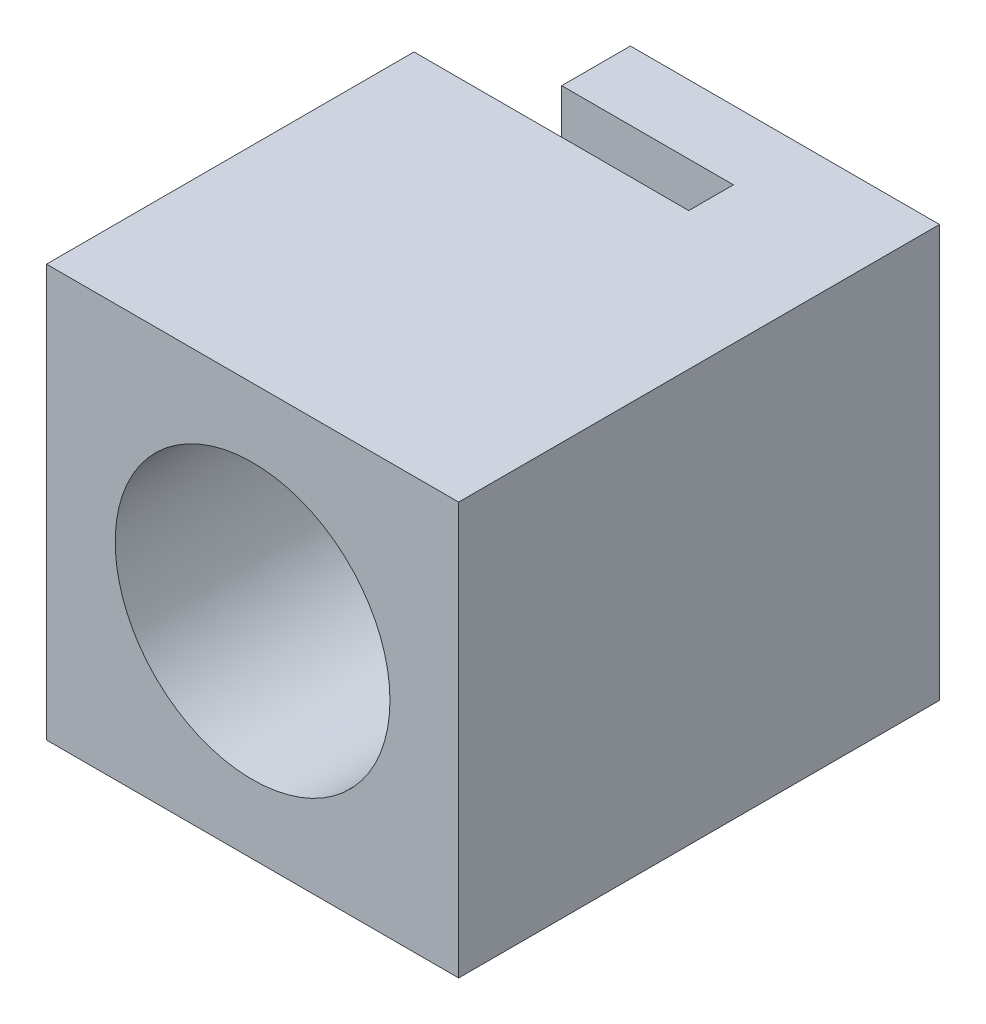
ISO-10303-21;
HEADER;
FILE_DESCRIPTION(('STEP AP214'),'2;1');
FILE_NAME('part.step','',(''),(''),'','','');
FILE_SCHEMA(('AUTOMOTIVE_DESIGN { 1 0 10303 214 1 1 1 1 }'));
ENDSEC;
DATA;
#1=APPLICATION_CONTEXT('core data for automotive mechanical design processes');
#2=APPLICATION_PROTOCOL_DEFINITION('international standard','automotive_design',2000,#1);
#3=PRODUCT_CONTEXT('',#1,'mechanical');
#4=PRODUCT('Part','Part','',(#3));
#5=PRODUCT_RELATED_PRODUCT_CATEGORY('part','',(#4));
#6=PRODUCT_DEFINITION_FORMATION('','',#4);
#7=PRODUCT_DEFINITION_CONTEXT('part definition',#1,'design');
#8=PRODUCT_DEFINITION('design','',#6,#7);
#9=PRODUCT_DEFINITION_SHAPE('','',#8);
#10=(LENGTH_UNIT() NAMED_UNIT(*) SI_UNIT(.MILLI.,.METRE.));
#11=(NAMED_UNIT(*) PLANE_ANGLE_UNIT() SI_UNIT($,.RADIAN.));
#12=(NAMED_UNIT(*) SI_UNIT($,.STERADIAN.) SOLID_ANGLE_UNIT());
#13=UNCERTAINTY_MEASURE_WITH_UNIT(LENGTH_MEASURE(1.E-05),#10,'distance_accuracy_value','');
#14=(GEOMETRIC_REPRESENTATION_CONTEXT(3) GLOBAL_UNCERTAINTY_ASSIGNED_CONTEXT((#13)) GLOBAL_UNIT_ASSIGNED_CONTEXT((#10,
#11,#12)) REPRESENTATION_CONTEXT('',''));
#15=CARTESIAN_POINT('',(0.,0.,0.));
#16=DIRECTION('',(0.,0.,1.));
#17=DIRECTION('',(1.,0.,0.));
#18=AXIS2_PLACEMENT_3D('',#15,#16,#17);
#19=CARTESIAN_POINT('',(-6.,6.,14.));
#20=DIRECTION('',(0.,-1.,0.));
#21=DIRECTION('',(0.,0.,-1.));
#22=AXIS2_PLACEMENT_3D('',#19,#20,#21);
#23=PLANE('',#22);
#24=DIRECTION('',(0.,0.,-1.));
#25=VECTOR('',#24,1.);
#26=CARTESIAN_POINT('',(-3.,6.,14.));
#27=LINE('',#26,#25);
#28=CARTESIAN_POINT('',(-3.,6.,2.));
#29=VERTEX_POINT('',#28);
#30=CARTESIAN_POINT('',(-3.,6.,0.));
#31=VERTEX_POINT('',#30);
#32=EDGE_CURVE('E97',#29,#31,#27,.T.);
#33=ORIENTED_EDGE('',*,*,#32,.F.);
#34=DIRECTION('',(1.,0.,0.));
#35=VECTOR('',#34,1.);
#36=CARTESIAN_POINT('',(-6.,6.,2.));
#37=LINE('',#36,#35);
#38=CARTESIAN_POINT('',(2.,6.,2.));
#39=VERTEX_POINT('',#38);
#40=EDGE_CURVE('E105',#29,#39,#37,.T.);
#41=ORIENTED_EDGE('',*,*,#40,.T.);
#42=DIRECTION('',(0.,0.,1.));
#43=VECTOR('',#42,1.);
#44=CARTESIAN_POINT('',(2.,6.,14.));
#45=LINE('',#44,#43);
#46=CARTESIAN_POINT('',(2.,6.,3.3));
#47=VERTEX_POINT('',#46);
#48=EDGE_CURVE('E112',#39,#47,#45,.T.);
#49=ORIENTED_EDGE('',*,*,#48,.T.);
#50=DIRECTION('',(-1.,0.,0.));
#51=VECTOR('',#50,1.);
#52=CARTESIAN_POINT('',(-6.,6.,3.3));
#53=LINE('',#52,#51);
#54=CARTESIAN_POINT('',(-6.,6.,3.3));
#55=VERTEX_POINT('',#54);
#56=EDGE_CURVE('E115',#47,#55,#53,.T.);
#57=ORIENTED_EDGE('',*,*,#56,.T.);
#58=DIRECTION('',(0.,0.,-1.));
#59=VECTOR('',#58,1.);
#60=CARTESIAN_POINT('',(-6.,6.,14.));
#61=LINE('',#60,#59);
#62=CARTESIAN_POINT('',(-6.,6.,14.));
#63=VERTEX_POINT('',#62);
#64=EDGE_CURVE('E149',#63,#55,#61,.T.);
#65=ORIENTED_EDGE('',*,*,#64,.F.);
#66=DIRECTION('',(-1.,0.,0.));
#67=VECTOR('',#66,1.);
#68=CARTESIAN_POINT('',(-6.,6.,14.));
#69=LINE('',#68,#67);
#70=CARTESIAN_POINT('',(6.,6.,14.));
#71=VERTEX_POINT('',#70);
#72=EDGE_CURVE('E132',#71,#63,#69,.T.);
#73=ORIENTED_EDGE('',*,*,#72,.F.);
#74=DIRECTION('',(0.,0.,-1.));
#75=VECTOR('',#74,1.);
#76=CARTESIAN_POINT('',(6.,6.,14.));
#77=LINE('',#76,#75);
#78=CARTESIAN_POINT('',(6.,6.,0.));
#79=VERTEX_POINT('',#78);
#80=EDGE_CURVE('E152',#71,#79,#77,.T.);
#81=ORIENTED_EDGE('',*,*,#80,.T.);
#82=DIRECTION('',(-1.,0.,0.));
#83=VECTOR('',#82,1.);
#84=CARTESIAN_POINT('',(-6.,6.,0.));
#85=LINE('',#84,#83);
#86=EDGE_CURVE('E107',#79,#31,#85,.T.);
#87=ORIENTED_EDGE('',*,*,#86,.T.);
#88=EDGE_LOOP('',(#33,#41,#49,#57,#65,#73,#81,#87));
#89=FACE_BOUND('',#88,.T.);
#90=ADVANCED_FACE('F33',(#89),#23,.F.);
#91=CARTESIAN_POINT('',(-6.,-6.,14.));
#92=DIRECTION('',(0.,1.,0.));
#93=DIRECTION('',(0.,0.,1.));
#94=AXIS2_PLACEMENT_3D('',#91,#92,#93);
#95=PLANE('',#94);
#96=DIRECTION('',(0.,0.,1.));
#97=VECTOR('',#96,1.);
#98=CARTESIAN_POINT('',(-3.,-6.,14.));
#99=LINE('',#98,#97);
#100=CARTESIAN_POINT('',(-3.,-6.,0.));
#101=VERTEX_POINT('',#100);
#102=CARTESIAN_POINT('',(-3.,-6.,2.));
#103=VERTEX_POINT('',#102);
#104=EDGE_CURVE('E47',#101,#103,#99,.T.);
#105=ORIENTED_EDGE('',*,*,#104,.F.);
#106=DIRECTION('',(1.,0.,0.));
#107=VECTOR('',#106,1.);
#108=CARTESIAN_POINT('',(-6.,-6.,0.));
#109=LINE('',#108,#107);
#110=CARTESIAN_POINT('',(6.,-6.,0.));
#111=VERTEX_POINT('',#110);
#112=EDGE_CURVE('E133',#101,#111,#109,.T.);
#113=ORIENTED_EDGE('',*,*,#112,.T.);
#114=DIRECTION('',(0.,0.,-1.));
#115=VECTOR('',#114,1.);
#116=CARTESIAN_POINT('',(6.,-6.,14.));
#117=LINE('',#116,#115);
#118=CARTESIAN_POINT('',(6.,-6.,14.));
#119=VERTEX_POINT('',#118);
#120=EDGE_CURVE('E139',#119,#111,#117,.T.);
#121=ORIENTED_EDGE('',*,*,#120,.F.);
#122=DIRECTION('',(1.,0.,0.));
#123=VECTOR('',#122,1.);
#124=CARTESIAN_POINT('',(-6.,-6.,14.));
#125=LINE('',#124,#123);
#126=CARTESIAN_POINT('',(-6.,-6.,14.));
#127=VERTEX_POINT('',#126);
#128=EDGE_CURVE('E137',#127,#119,#125,.T.);
#129=ORIENTED_EDGE('',*,*,#128,.F.);
#130=DIRECTION('',(0.,0.,-1.));
#131=VECTOR('',#130,1.);
#132=CARTESIAN_POINT('',(-6.,-6.,14.));
#133=LINE('',#132,#131);
#134=CARTESIAN_POINT('',(-6.,-6.,3.3));
#135=VERTEX_POINT('',#134);
#136=EDGE_CURVE('E146',#127,#135,#133,.T.);
#137=ORIENTED_EDGE('',*,*,#136,.T.);
#138=DIRECTION('',(1.,0.,0.));
#139=VECTOR('',#138,1.);
#140=CARTESIAN_POINT('',(-6.,-6.,3.3));
#141=LINE('',#140,#139);
#142=CARTESIAN_POINT('',(2.,-6.,3.3));
#143=VERTEX_POINT('',#142);
#144=EDGE_CURVE('E41',#135,#143,#141,.T.);
#145=ORIENTED_EDGE('',*,*,#144,.T.);
#146=DIRECTION('',(0.,0.,-1.));
#147=VECTOR('',#146,1.);
#148=CARTESIAN_POINT('',(2.,-6.,14.));
#149=LINE('',#148,#147);
#150=CARTESIAN_POINT('',(2.,-6.,2.));
#151=VERTEX_POINT('',#150);
#152=EDGE_CURVE('E154',#143,#151,#149,.T.);
#153=ORIENTED_EDGE('',*,*,#152,.T.);
#154=DIRECTION('',(-1.,0.,0.));
#155=VECTOR('',#154,1.);
#156=CARTESIAN_POINT('',(-6.,-6.,2.));
#157=LINE('',#156,#155);
#158=EDGE_CURVE('E157',#151,#103,#157,.T.);
#159=ORIENTED_EDGE('',*,*,#158,.T.);
#160=EDGE_LOOP('',(#105,#113,#121,#129,#137,#145,#153,#159));
#161=FACE_BOUND('',#160,.T.);
#162=ADVANCED_FACE('F160',(#161),#95,.F.);
#163=CARTESIAN_POINT('',(0.,0.,0.));
#164=DIRECTION('',(0.,0.,1.));
#165=DIRECTION('',(1.,0.,0.));
#166=AXIS2_PLACEMENT_3D('',#163,#164,#165);
#167=PLANE('',#166);
#168=DIRECTION('',(0.,-1.,0.));
#169=VECTOR('',#168,1.);
#170=CARTESIAN_POINT('',(-3.,0.,0.));
#171=LINE('',#170,#169);
#172=EDGE_CURVE('E108',#31,#101,#171,.T.);
#173=ORIENTED_EDGE('',*,*,#172,.F.);
#174=ORIENTED_EDGE('',*,*,#86,.F.);
#175=DIRECTION('',(0.,1.,0.));
#176=VECTOR('',#175,1.);
#177=CARTESIAN_POINT('',(6.,6.,0.));
#178=LINE('',#177,#176);
#179=EDGE_CURVE('E126',#111,#79,#178,.T.);
#180=ORIENTED_EDGE('',*,*,#179,.F.);
#181=ORIENTED_EDGE('',*,*,#112,.F.);
#182=EDGE_LOOP('',(#173,#174,#180,#181));
#183=FACE_BOUND('',#182,.T.);
#184=ADVANCED_FACE('F180',(#183),#167,.F.);
#185=CARTESIAN_POINT('',(2.,-7.14827208394712,2.));
#186=DIRECTION('',(0.,0.,-1.));
#187=DIRECTION('',(-1.,0.,0.));
#188=AXIS2_PLACEMENT_3D('',#185,#186,#187);
#189=PLANE('',#188);
#190=DIRECTION('',(0.,1.,0.));
#191=VECTOR('',#190,1.);
#192=CARTESIAN_POINT('',(-3.,-7.14827208394712,2.));
#193=LINE('',#192,#191);
#194=EDGE_CURVE('E11',#103,#29,#193,.T.);
#195=ORIENTED_EDGE('',*,*,#194,.F.);
#196=ORIENTED_EDGE('',*,*,#158,.F.);
#197=DIRECTION('',(0.,-1.,0.));
#198=VECTOR('',#197,1.);
#199=CARTESIAN_POINT('',(2.,-7.14827208394712,2.));
#200=LINE('',#199,#198);
#201=EDGE_CURVE('E55',#39,#151,#200,.T.);
#202=ORIENTED_EDGE('',*,*,#201,.F.);
#203=ORIENTED_EDGE('',*,*,#40,.F.);
#204=EDGE_LOOP('',(#195,#196,#202,#203));
#205=FACE_BOUND('',#204,.T.);
#206=ADVANCED_FACE('F110',(#205),#189,.F.);
#207=CARTESIAN_POINT('',(-6.,6.,14.));
#208=DIRECTION('',(1.,0.,0.));
#209=DIRECTION('',(0.,0.,-1.));
#210=AXIS2_PLACEMENT_3D('',#207,#208,#209);
#211=PLANE('',#210);
#212=ORIENTED_EDGE('',*,*,#64,.T.);
#213=DIRECTION('',(0.,-1.,0.));
#214=VECTOR('',#213,1.);
#215=CARTESIAN_POINT('',(-6.,6.,3.3));
#216=LINE('',#215,#214);
#217=EDGE_CURVE('E111',#55,#135,#216,.T.);
#218=ORIENTED_EDGE('',*,*,#217,.T.);
#219=ORIENTED_EDGE('',*,*,#136,.F.);
#220=DIRECTION('',(0.,-1.,0.));
#221=VECTOR('',#220,1.);
#222=CARTESIAN_POINT('',(-6.,6.,14.));
#223=LINE('',#222,#221);
#224=EDGE_CURVE('E135',#63,#127,#223,.T.);
#225=ORIENTED_EDGE('',*,*,#224,.F.);
#226=EDGE_LOOP('',(#212,#218,#219,#225));
#227=FACE_BOUND('',#226,.T.);
#228=ADVANCED_FACE('F169',(#227),#211,.F.);
#229=CARTESIAN_POINT('',(6.,6.,14.));
#230=DIRECTION('',(-1.,0.,0.));
#231=DIRECTION('',(0.,-1.,0.));
#232=AXIS2_PLACEMENT_3D('',#229,#230,#231);
#233=PLANE('',#232);
#234=ORIENTED_EDGE('',*,*,#179,.T.);
#235=ORIENTED_EDGE('',*,*,#80,.F.);
#236=DIRECTION('',(0.,1.,0.));
#237=VECTOR('',#236,1.);
#238=CARTESIAN_POINT('',(6.,6.,14.));
#239=LINE('',#238,#237);
#240=EDGE_CURVE('E129',#119,#71,#239,.T.);
#241=ORIENTED_EDGE('',*,*,#240,.F.);
#242=ORIENTED_EDGE('',*,*,#120,.T.);
#243=EDGE_LOOP('',(#234,#235,#241,#242));
#244=FACE_BOUND('',#243,.T.);
#245=ADVANCED_FACE('F35',(#244),#233,.F.);
#246=CARTESIAN_POINT('',(0.,0.,14.));
#247=DIRECTION('',(0.,0.,1.));
#248=DIRECTION('',(1.,0.,0.));
#249=AXIS2_PLACEMENT_3D('',#246,#247,#248);
#250=PLANE('',#249);
#251=CARTESIAN_POINT('',(0.,0.,14.));
#252=DIRECTION('',(0.,0.,1.));
#253=DIRECTION('',(1.,0.,0.));
#254=AXIS2_PLACEMENT_3D('',#251,#252,#253);
#255=CIRCLE('',#254,4.);
#256=CARTESIAN_POINT('',(4.,0.,14.));
#257=VERTEX_POINT('',#256);
#258=EDGE_CURVE('E122',#257,#257,#255,.T.);
#259=ORIENTED_EDGE('',*,*,#258,.F.);
#260=EDGE_LOOP('',(#259));
#261=FACE_BOUND('',#260,.T.);
#262=ORIENTED_EDGE('',*,*,#240,.T.);
#263=ORIENTED_EDGE('',*,*,#72,.T.);
#264=ORIENTED_EDGE('',*,*,#224,.T.);
#265=ORIENTED_EDGE('',*,*,#128,.T.);
#266=EDGE_LOOP('',(#262,#263,#264,#265));
#267=FACE_BOUND('',#266,.T.);
#268=ADVANCED_FACE('F185',(#261,#267),#250,.T.);
#269=CARTESIAN_POINT('',(0.,0.,8.));
#270=DIRECTION('',(0.,0.,1.));
#271=DIRECTION('',(1.,0.,0.));
#272=AXIS2_PLACEMENT_3D('',#269,#270,#271);
#273=CYLINDRICAL_SURFACE('',#272,4.);
#274=CARTESIAN_POINT('',(0.,0.,8.));
#275=DIRECTION('',(0.,0.,1.));
#276=DIRECTION('',(1.,0.,0.));
#277=AXIS2_PLACEMENT_3D('',#274,#275,#276);
#278=CIRCLE('',#277,4.);
#279=CARTESIAN_POINT('',(4.,0.,8.));
#280=VERTEX_POINT('',#279);
#281=EDGE_CURVE('E123',#280,#280,#278,.T.);
#282=ORIENTED_EDGE('',*,*,#281,.F.);
#283=EDGE_LOOP('',(#282));
#284=FACE_BOUND('',#283,.T.);
#285=ORIENTED_EDGE('',*,*,#258,.T.);
#286=EDGE_LOOP('',(#285));
#287=FACE_BOUND('',#286,.T.);
#288=ADVANCED_FACE('F187',(#284,#287),#273,.F.);
#289=CARTESIAN_POINT('',(0.,0.,8.));
#290=DIRECTION('',(0.,0.,1.));
#291=DIRECTION('',(1.,0.,0.));
#292=AXIS2_PLACEMENT_3D('',#289,#290,#291);
#293=PLANE('',#292);
#294=ORIENTED_EDGE('',*,*,#281,.T.);
#295=EDGE_LOOP('',(#294));
#296=FACE_BOUND('',#295,.T.);
#297=ADVANCED_FACE('F194',(#296),#293,.T.);
#298=CARTESIAN_POINT('',(2.,-7.14827208394712,3.3));
#299=DIRECTION('',(0.,0.,1.));
#300=DIRECTION('',(1.,0.,0.));
#301=AXIS2_PLACEMENT_3D('',#298,#299,#300);
#302=PLANE('',#301);
#303=DIRECTION('',(0.,1.,0.));
#304=VECTOR('',#303,1.);
#305=CARTESIAN_POINT('',(2.,-7.14827208394712,3.3));
#306=LINE('',#305,#304);
#307=EDGE_CURVE('E167',#143,#47,#306,.T.);
#308=ORIENTED_EDGE('',*,*,#307,.F.);
#309=ORIENTED_EDGE('',*,*,#144,.F.);
#310=ORIENTED_EDGE('',*,*,#217,.F.);
#311=ORIENTED_EDGE('',*,*,#56,.F.);
#312=EDGE_LOOP('',(#308,#309,#310,#311));
#313=FACE_BOUND('',#312,.T.);
#314=ADVANCED_FACE('F165',(#313),#302,.F.);
#315=CARTESIAN_POINT('',(2.,0.,0.));
#316=DIRECTION('',(1.,0.,0.));
#317=DIRECTION('',(0.,0.,-1.));
#318=AXIS2_PLACEMENT_3D('',#315,#316,#317);
#319=PLANE('',#318);
#320=ORIENTED_EDGE('',*,*,#201,.T.);
#321=ORIENTED_EDGE('',*,*,#152,.F.);
#322=ORIENTED_EDGE('',*,*,#307,.T.);
#323=ORIENTED_EDGE('',*,*,#48,.F.);
#324=EDGE_LOOP('',(#320,#321,#322,#323));
#325=FACE_BOUND('',#324,.T.);
#326=ADVANCED_FACE('F172',(#325),#319,.F.);
#327=CARTESIAN_POINT('',(-3.,0.,0.));
#328=DIRECTION('',(-1.,0.,0.));
#329=DIRECTION('',(0.,0.,1.));
#330=AXIS2_PLACEMENT_3D('',#327,#328,#329);
#331=PLANE('',#330);
#332=ORIENTED_EDGE('',*,*,#172,.T.);
#333=ORIENTED_EDGE('',*,*,#104,.T.);
#334=ORIENTED_EDGE('',*,*,#194,.T.);
#335=ORIENTED_EDGE('',*,*,#32,.T.);
#336=EDGE_LOOP('',(#332,#333,#334,#335));
#337=FACE_BOUND('',#336,.T.);
#338=ADVANCED_FACE('F96',(#337),#331,.T.);
#339=CLOSED_SHELL('',(#90,#162,#184,#206,#228,#245,#268,#288,#297,#314,#326,#338));
#340=MANIFOLD_SOLID_BREP('B2',#339);
#341=ADVANCED_BREP_SHAPE_REPRESENTATION('',(#18,#340),#14);
#342=SHAPE_DEFINITION_REPRESENTATION(#9,#341);
ENDSEC;
END-ISO-10303-21;
